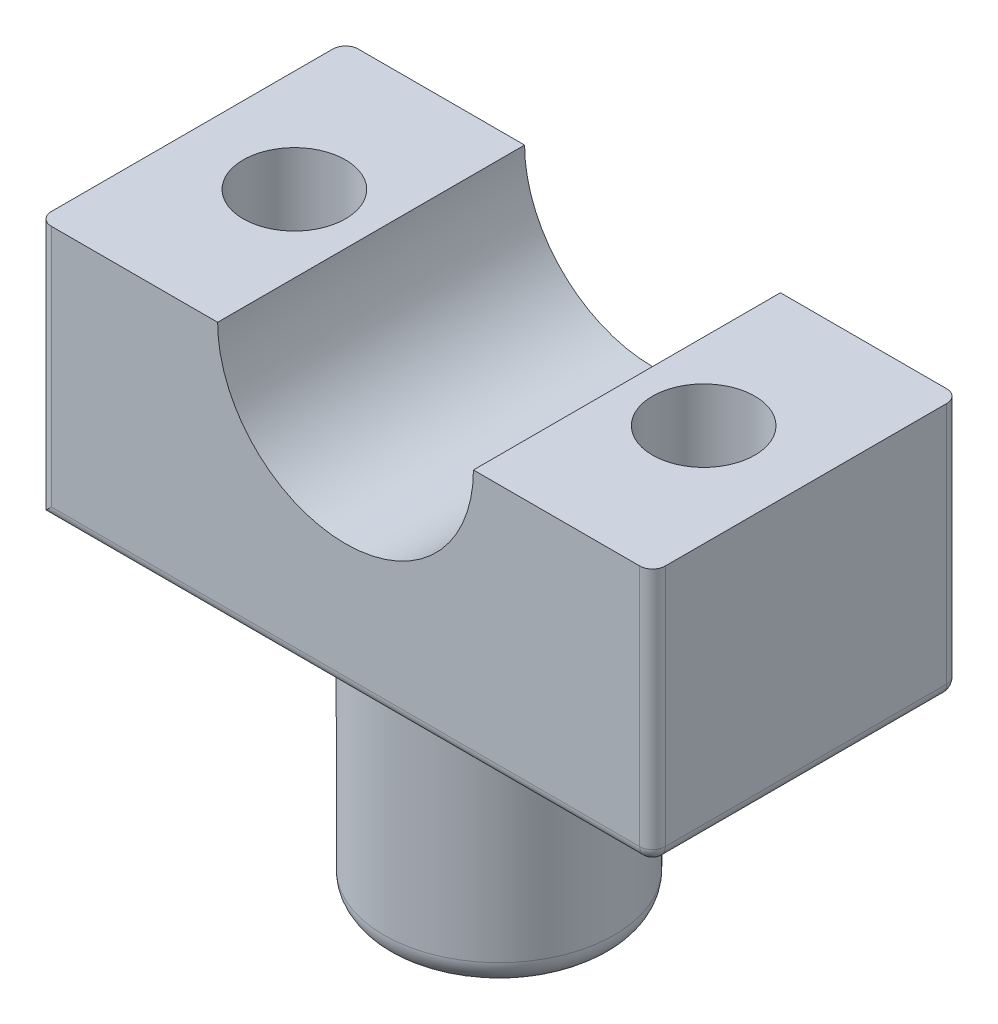
ISO-10303-21;
HEADER;
FILE_DESCRIPTION(('STEP AP214'),'2;1');
FILE_NAME('part.step','',(''),(''),'','','');
FILE_SCHEMA(('AUTOMOTIVE_DESIGN { 1 0 10303 214 1 1 1 1 }'));
ENDSEC;
DATA;
#1=APPLICATION_CONTEXT('core data for automotive mechanical design processes');
#2=APPLICATION_PROTOCOL_DEFINITION('international standard','automotive_design',2000,#1);
#3=PRODUCT_CONTEXT('',#1,'mechanical');
#4=PRODUCT('Part','Part','',(#3));
#5=PRODUCT_RELATED_PRODUCT_CATEGORY('part','',(#4));
#6=PRODUCT_DEFINITION_FORMATION('','',#4);
#7=PRODUCT_DEFINITION_CONTEXT('part definition',#1,'design');
#8=PRODUCT_DEFINITION('design','',#6,#7);
#9=PRODUCT_DEFINITION_SHAPE('','',#8);
#10=(LENGTH_UNIT() NAMED_UNIT(*) SI_UNIT(.MILLI.,.METRE.));
#11=(NAMED_UNIT(*) PLANE_ANGLE_UNIT() SI_UNIT($,.RADIAN.));
#12=(NAMED_UNIT(*) SI_UNIT($,.STERADIAN.) SOLID_ANGLE_UNIT());
#13=UNCERTAINTY_MEASURE_WITH_UNIT(LENGTH_MEASURE(1.E-05),#10,'distance_accuracy_value','');
#14=(GEOMETRIC_REPRESENTATION_CONTEXT(3) GLOBAL_UNCERTAINTY_ASSIGNED_CONTEXT((#13)) GLOBAL_UNIT_ASSIGNED_CONTEXT((#10,
#11,#12)) REPRESENTATION_CONTEXT('',''));
#15=CARTESIAN_POINT('',(0.,0.,0.));
#16=DIRECTION('',(0.,0.,1.));
#17=DIRECTION('',(1.,0.,0.));
#18=AXIS2_PLACEMENT_3D('',#15,#16,#17);
#19=CARTESIAN_POINT('',(0.,0.,12.));
#20=DIRECTION('',(0.,1.,0.));
#21=DIRECTION('',(0.,0.,1.));
#22=AXIS2_PLACEMENT_3D('',#19,#20,#21);
#23=PLANE('',#22);
#24=CARTESIAN_POINT('',(4.,0.,6.));
#25=DIRECTION('',(0.,1.,0.));
#26=DIRECTION('',(0.,0.,1.));
#27=AXIS2_PLACEMENT_3D('',#24,#25,#26);
#28=CIRCLE('',#27,2.);
#29=CARTESIAN_POINT('',(4.,0.,8.));
#30=VERTEX_POINT('',#29);
#31=EDGE_CURVE('E161',#30,#30,#28,.T.);
#32=ORIENTED_EDGE('',*,*,#31,.T.);
#33=EDGE_LOOP('',(#32));
#34=FACE_BOUND('',#33,.T.);
#35=DIRECTION('',(0.,0.,-1.));
#36=VECTOR('',#35,1.);
#37=CARTESIAN_POINT('',(0.,0.,12.));
#38=LINE('',#37,#36);
#39=CARTESIAN_POINT('',(0.,0.,11.5));
#40=VERTEX_POINT('',#39);
#41=CARTESIAN_POINT('',(0.,0.,0.5));
#42=VERTEX_POINT('',#41);
#43=EDGE_CURVE('E169',#40,#42,#38,.T.);
#44=ORIENTED_EDGE('',*,*,#43,.T.);
#45=DIRECTION('',(1.,0.,0.));
#46=VECTOR('',#45,1.);
#47=CARTESIAN_POINT('',(0.,0.,0.5));
#48=LINE('',#47,#46);
#49=CARTESIAN_POINT('',(12.,0.,0.5));
#50=VERTEX_POINT('',#49);
#51=EDGE_CURVE('E193',#42,#50,#48,.T.);
#52=ORIENTED_EDGE('',*,*,#51,.T.);
#53=CARTESIAN_POINT('',(12.,0.,6.));
#54=DIRECTION('',(0.,1.,0.));
#55=DIRECTION('',(0.,0.,1.));
#56=AXIS2_PLACEMENT_3D('',#53,#54,#55);
#57=CIRCLE('',#56,5.5);
#58=CARTESIAN_POINT('',(12.,0.,11.5));
#59=VERTEX_POINT('',#58);
#60=EDGE_CURVE('E181',#50,#59,#57,.T.);
#61=ORIENTED_EDGE('',*,*,#60,.T.);
#62=DIRECTION('',(1.,0.,0.));
#63=VECTOR('',#62,1.);
#64=CARTESIAN_POINT('',(0.,0.,11.5));
#65=LINE('',#64,#63);
#66=EDGE_CURVE('E185',#59,#40,#65,.F.);
#67=ORIENTED_EDGE('',*,*,#66,.T.);
#68=EDGE_LOOP('',(#44,#52,#61,#67));
#69=FACE_BOUND('',#68,.T.);
#70=ADVANCED_FACE('F37',(#34,#69),#23,.F.);
#71=CARTESIAN_POINT('',(0.,0.,12.));
#72=DIRECTION('',(1.,0.,0.));
#73=DIRECTION('',(0.,0.,-1.));
#74=AXIS2_PLACEMENT_3D('',#71,#72,#73);
#75=PLANE('',#74);
#76=DIRECTION('',(0.,0.,-1.));
#77=VECTOR('',#76,1.);
#78=CARTESIAN_POINT('',(0.,10.,12.));
#79=LINE('',#78,#77);
#80=CARTESIAN_POINT('',(0.,10.,11.5));
#81=VERTEX_POINT('',#80);
#82=CARTESIAN_POINT('',(0.,10.,0.5));
#83=VERTEX_POINT('',#82);
#84=EDGE_CURVE('E155',#81,#83,#79,.T.);
#85=ORIENTED_EDGE('',*,*,#84,.T.);
#86=DIRECTION('',(0.,-1.,0.));
#87=VECTOR('',#86,1.);
#88=CARTESIAN_POINT('',(0.,0.,0.5));
#89=LINE('',#88,#87);
#90=EDGE_CURVE('E204',#83,#42,#89,.T.);
#91=ORIENTED_EDGE('',*,*,#90,.T.);
#92=ORIENTED_EDGE('',*,*,#43,.F.);
#93=DIRECTION('',(0.,-1.,0.));
#94=VECTOR('',#93,1.);
#95=CARTESIAN_POINT('',(0.,10.,11.5));
#96=LINE('',#95,#94);
#97=EDGE_CURVE('E202',#40,#81,#96,.F.);
#98=ORIENTED_EDGE('',*,*,#97,.T.);
#99=EDGE_LOOP('',(#85,#91,#92,#98));
#100=FACE_BOUND('',#99,.T.);
#101=ADVANCED_FACE('F281',(#100),#75,.F.);
#102=EDGE_CURVE('E182',#59,#50,#57,.T.);
#103=ORIENTED_EDGE('',*,*,#102,.T.);
#104=DIRECTION('',(1.,0.,0.));
#105=VECTOR('',#104,1.);
#106=CARTESIAN_POINT('',(0.,0.,0.5));
#107=LINE('',#106,#105);
#108=CARTESIAN_POINT('',(23.5,0.,0.5));
#109=VERTEX_POINT('',#108);
#110=EDGE_CURVE('E191',#50,#109,#107,.T.);
#111=ORIENTED_EDGE('',*,*,#110,.T.);
#112=DIRECTION('',(0.,0.,-1.));
#113=VECTOR('',#112,1.);
#114=CARTESIAN_POINT('',(23.5,0.,12.));
#115=LINE('',#114,#113);
#116=CARTESIAN_POINT('',(23.5,0.,11.5));
#117=VERTEX_POINT('',#116);
#118=EDGE_CURVE('E189',#109,#117,#115,.F.);
#119=ORIENTED_EDGE('',*,*,#118,.T.);
#120=DIRECTION('',(1.,0.,0.));
#121=VECTOR('',#120,1.);
#122=CARTESIAN_POINT('',(0.,0.,11.5));
#123=LINE('',#122,#121);
#124=EDGE_CURVE('E187',#117,#59,#123,.F.);
#125=ORIENTED_EDGE('',*,*,#124,.T.);
#126=EDGE_LOOP('',(#103,#111,#119,#125));
#127=FACE_BOUND('',#126,.T.);
#128=CARTESIAN_POINT('',(20.,0.,6.));
#129=DIRECTION('',(0.,1.,0.));
#130=DIRECTION('',(0.,0.,1.));
#131=AXIS2_PLACEMENT_3D('',#128,#129,#130);
#132=CIRCLE('',#131,2.);
#133=CARTESIAN_POINT('',(20.,0.,8.));
#134=VERTEX_POINT('',#133);
#135=EDGE_CURVE('E262',#134,#134,#132,.T.);
#136=ORIENTED_EDGE('',*,*,#135,.T.);
#137=EDGE_LOOP('',(#136));
#138=FACE_BOUND('',#137,.T.);
#139=ADVANCED_FACE('F278',(#127,#138),#23,.F.);
#140=CARTESIAN_POINT('',(24.,0.,12.));
#141=DIRECTION('',(-1.,0.,0.));
#142=DIRECTION('',(0.,0.,1.));
#143=AXIS2_PLACEMENT_3D('',#140,#141,#142);
#144=PLANE('',#143);
#145=DIRECTION('',(0.,0.,-1.));
#146=VECTOR('',#145,1.);
#147=CARTESIAN_POINT('',(24.,0.5,12.));
#148=LINE('',#147,#146);
#149=CARTESIAN_POINT('',(24.,0.5,11.5));
#150=VERTEX_POINT('',#149);
#151=CARTESIAN_POINT('',(24.,0.5,0.5));
#152=VERTEX_POINT('',#151);
#153=EDGE_CURVE('E54',#150,#152,#148,.T.);
#154=ORIENTED_EDGE('',*,*,#153,.T.);
#155=DIRECTION('',(0.,1.,0.));
#156=VECTOR('',#155,1.);
#157=CARTESIAN_POINT('',(24.,0.,0.5));
#158=LINE('',#157,#156);
#159=CARTESIAN_POINT('',(24.,10.,0.5));
#160=VERTEX_POINT('',#159);
#161=EDGE_CURVE('E217',#152,#160,#158,.T.);
#162=ORIENTED_EDGE('',*,*,#161,.T.);
#163=DIRECTION('',(0.,0.,-1.));
#164=VECTOR('',#163,1.);
#165=CARTESIAN_POINT('',(24.,10.,12.));
#166=LINE('',#165,#164);
#167=CARTESIAN_POINT('',(24.,10.,11.5));
#168=VERTEX_POINT('',#167);
#169=EDGE_CURVE('E147',#168,#160,#166,.T.);
#170=ORIENTED_EDGE('',*,*,#169,.F.);
#171=DIRECTION('',(0.,1.,0.));
#172=VECTOR('',#171,1.);
#173=CARTESIAN_POINT('',(24.,0.,11.5));
#174=LINE('',#173,#172);
#175=EDGE_CURVE('E59',#168,#150,#174,.F.);
#176=ORIENTED_EDGE('',*,*,#175,.T.);
#177=EDGE_LOOP('',(#154,#162,#170,#176));
#178=FACE_BOUND('',#177,.T.);
#179=ADVANCED_FACE('F270',(#178),#144,.F.);
#180=CARTESIAN_POINT('',(17.,10.,12.));
#181=DIRECTION('',(0.,-1.,0.));
#182=DIRECTION('',(0.,0.,-1.));
#183=AXIS2_PLACEMENT_3D('',#180,#181,#182);
#184=PLANE('',#183);
#185=CARTESIAN_POINT('',(20.,10.,6.));
#186=DIRECTION('',(0.,1.,0.));
#187=DIRECTION('',(0.,0.,1.));
#188=AXIS2_PLACEMENT_3D('',#185,#186,#187);
#189=CIRCLE('',#188,2.);
#190=CARTESIAN_POINT('',(20.,10.,8.));
#191=VERTEX_POINT('',#190);
#192=EDGE_CURVE('E254',#191,#191,#189,.T.);
#193=ORIENTED_EDGE('',*,*,#192,.F.);
#194=EDGE_LOOP('',(#193));
#195=FACE_BOUND('',#194,.T.);
#196=ORIENTED_EDGE('',*,*,#169,.T.);
#197=CARTESIAN_POINT('',(23.5,10.,0.5));
#198=DIRECTION('',(0.,-1.,0.));
#199=DIRECTION('',(0.,0.,-1.));
#200=AXIS2_PLACEMENT_3D('',#197,#198,#199);
#201=CIRCLE('',#200,0.5);
#202=CARTESIAN_POINT('',(23.5,10.,0.));
#203=VERTEX_POINT('',#202);
#204=EDGE_CURVE('E11',#160,#203,#201,.F.);
#205=ORIENTED_EDGE('',*,*,#204,.T.);
#206=DIRECTION('',(-1.,0.,0.));
#207=VECTOR('',#206,1.);
#208=CARTESIAN_POINT('',(17.,10.,0.));
#209=LINE('',#208,#207);
#210=CARTESIAN_POINT('',(17.,10.,0.));
#211=VERTEX_POINT('',#210);
#212=EDGE_CURVE('E144',#203,#211,#209,.T.);
#213=ORIENTED_EDGE('',*,*,#212,.T.);
#214=DIRECTION('',(0.,0.,-1.));
#215=VECTOR('',#214,1.);
#216=CARTESIAN_POINT('',(17.,10.,12.));
#217=LINE('',#216,#215);
#218=CARTESIAN_POINT('',(17.,10.,12.));
#219=VERTEX_POINT('',#218);
#220=EDGE_CURVE('E140',#219,#211,#217,.T.);
#221=ORIENTED_EDGE('',*,*,#220,.F.);
#222=DIRECTION('',(-1.,0.,0.));
#223=VECTOR('',#222,1.);
#224=CARTESIAN_POINT('',(17.,10.,12.));
#225=LINE('',#224,#223);
#226=CARTESIAN_POINT('',(23.5,10.,12.));
#227=VERTEX_POINT('',#226);
#228=EDGE_CURVE('E126',#227,#219,#225,.T.);
#229=ORIENTED_EDGE('',*,*,#228,.F.);
#230=CARTESIAN_POINT('',(23.5,10.,11.5));
#231=DIRECTION('',(0.,-1.,0.));
#232=DIRECTION('',(0.,0.,-1.));
#233=AXIS2_PLACEMENT_3D('',#230,#231,#232);
#234=CIRCLE('',#233,0.5);
#235=EDGE_CURVE('E46',#227,#168,#234,.F.);
#236=ORIENTED_EDGE('',*,*,#235,.T.);
#237=EDGE_LOOP('',(#196,#205,#213,#221,#229,#236));
#238=FACE_BOUND('',#237,.T.);
#239=ADVANCED_FACE('F142',(#195,#238),#184,.F.);
#240=CARTESIAN_POINT('',(12.,10.,12.));
#241=DIRECTION('',(0.,0.,-1.));
#242=DIRECTION('',(-1.,0.,0.));
#243=AXIS2_PLACEMENT_3D('',#240,#241,#242);
#244=CYLINDRICAL_SURFACE('',#243,5.);
#245=CARTESIAN_POINT('',(12.,10.,0.));
#246=DIRECTION('',(0.,0.,-1.));
#247=DIRECTION('',(1.,0.,0.));
#248=AXIS2_PLACEMENT_3D('',#245,#246,#247);
#249=CIRCLE('',#248,5.);
#250=CARTESIAN_POINT('',(7.,10.,0.));
#251=VERTEX_POINT('',#250);
#252=EDGE_CURVE('E160',#211,#251,#249,.T.);
#253=ORIENTED_EDGE('',*,*,#252,.T.);
#254=DIRECTION('',(0.,0.,-1.));
#255=VECTOR('',#254,1.);
#256=CARTESIAN_POINT('',(7.,10.,12.));
#257=LINE('',#256,#255);
#258=CARTESIAN_POINT('',(7.,10.,12.));
#259=VERTEX_POINT('',#258);
#260=EDGE_CURVE('E148',#259,#251,#257,.T.);
#261=ORIENTED_EDGE('',*,*,#260,.F.);
#262=CARTESIAN_POINT('',(12.,10.,12.));
#263=DIRECTION('',(0.,0.,-1.));
#264=DIRECTION('',(1.,0.,0.));
#265=AXIS2_PLACEMENT_3D('',#262,#263,#264);
#266=CIRCLE('',#265,5.);
#267=EDGE_CURVE('E131',#219,#259,#266,.T.);
#268=ORIENTED_EDGE('',*,*,#267,.F.);
#269=ORIENTED_EDGE('',*,*,#220,.T.);
#270=EDGE_LOOP('',(#253,#261,#268,#269));
#271=FACE_BOUND('',#270,.T.);
#272=ADVANCED_FACE('F150',(#271),#244,.F.);
#273=CARTESIAN_POINT('',(0.,10.,12.));
#274=DIRECTION('',(0.,-1.,0.));
#275=DIRECTION('',(0.,0.,-1.));
#276=AXIS2_PLACEMENT_3D('',#273,#274,#275);
#277=PLANE('',#276);
#278=CARTESIAN_POINT('',(4.,10.,6.));
#279=DIRECTION('',(0.,1.,0.));
#280=DIRECTION('',(0.,0.,1.));
#281=AXIS2_PLACEMENT_3D('',#278,#279,#280);
#282=CIRCLE('',#281,2.);
#283=CARTESIAN_POINT('',(4.,10.,8.));
#284=VERTEX_POINT('',#283);
#285=EDGE_CURVE('E259',#284,#284,#282,.T.);
#286=ORIENTED_EDGE('',*,*,#285,.F.);
#287=EDGE_LOOP('',(#286));
#288=FACE_BOUND('',#287,.T.);
#289=DIRECTION('',(-1.,0.,0.));
#290=VECTOR('',#289,1.);
#291=CARTESIAN_POINT('',(0.,10.,0.));
#292=LINE('',#291,#290);
#293=CARTESIAN_POINT('',(0.5,10.,0.));
#294=VERTEX_POINT('',#293);
#295=EDGE_CURVE('E137',#251,#294,#292,.T.);
#296=ORIENTED_EDGE('',*,*,#295,.T.);
#297=CARTESIAN_POINT('',(0.5,10.,0.5));
#298=DIRECTION('',(0.,-1.,0.));
#299=DIRECTION('',(0.,0.,-1.));
#300=AXIS2_PLACEMENT_3D('',#297,#298,#299);
#301=CIRCLE('',#300,0.5);
#302=EDGE_CURVE('E208',#294,#83,#301,.F.);
#303=ORIENTED_EDGE('',*,*,#302,.T.);
#304=ORIENTED_EDGE('',*,*,#84,.F.);
#305=CARTESIAN_POINT('',(0.5,10.,11.5));
#306=DIRECTION('',(0.,-1.,0.));
#307=DIRECTION('',(0.,0.,-1.));
#308=AXIS2_PLACEMENT_3D('',#305,#306,#307);
#309=CIRCLE('',#308,0.5);
#310=CARTESIAN_POINT('',(0.5,10.,12.));
#311=VERTEX_POINT('',#310);
#312=EDGE_CURVE('E206',#81,#311,#309,.F.);
#313=ORIENTED_EDGE('',*,*,#312,.T.);
#314=DIRECTION('',(-1.,0.,0.));
#315=VECTOR('',#314,1.);
#316=CARTESIAN_POINT('',(0.,10.,12.));
#317=LINE('',#316,#315);
#318=EDGE_CURVE('E153',#259,#311,#317,.T.);
#319=ORIENTED_EDGE('',*,*,#318,.F.);
#320=ORIENTED_EDGE('',*,*,#260,.T.);
#321=EDGE_LOOP('',(#296,#303,#304,#313,#319,#320));
#322=FACE_BOUND('',#321,.T.);
#323=ADVANCED_FACE('F276',(#288,#322),#277,.F.);
#324=CARTESIAN_POINT('',(12.,10.,12.));
#325=DIRECTION('',(0.,0.,1.));
#326=DIRECTION('',(1.,0.,0.));
#327=AXIS2_PLACEMENT_3D('',#324,#325,#326);
#328=PLANE('',#327);
#329=ORIENTED_EDGE('',*,*,#318,.T.);
#330=DIRECTION('',(0.,-1.,0.));
#331=VECTOR('',#330,1.);
#332=CARTESIAN_POINT('',(0.5,0.,12.));
#333=LINE('',#332,#331);
#334=CARTESIAN_POINT('',(0.5,0.5,12.));
#335=VERTEX_POINT('',#334);
#336=EDGE_CURVE('E213',#311,#335,#333,.T.);
#337=ORIENTED_EDGE('',*,*,#336,.T.);
#338=DIRECTION('',(1.,0.,0.));
#339=VECTOR('',#338,1.);
#340=CARTESIAN_POINT('',(24.,0.5,12.));
#341=LINE('',#340,#339);
#342=CARTESIAN_POINT('',(23.5,0.5,12.));
#343=VERTEX_POINT('',#342);
#344=EDGE_CURVE('E210',#335,#343,#341,.T.);
#345=ORIENTED_EDGE('',*,*,#344,.T.);
#346=DIRECTION('',(0.,1.,0.));
#347=VECTOR('',#346,1.);
#348=CARTESIAN_POINT('',(23.5,10.,12.));
#349=LINE('',#348,#347);
#350=EDGE_CURVE('E134',#343,#227,#349,.T.);
#351=ORIENTED_EDGE('',*,*,#350,.T.);
#352=ORIENTED_EDGE('',*,*,#228,.T.);
#353=ORIENTED_EDGE('',*,*,#267,.T.);
#354=EDGE_LOOP('',(#329,#337,#345,#351,#352,#353));
#355=FACE_BOUND('',#354,.T.);
#356=ADVANCED_FACE('F129',(#355),#328,.T.);
#357=CARTESIAN_POINT('',(12.,10.,0.));
#358=DIRECTION('',(0.,0.,1.));
#359=DIRECTION('',(1.,0.,0.));
#360=AXIS2_PLACEMENT_3D('',#357,#358,#359);
#361=PLANE('',#360);
#362=DIRECTION('',(1.,0.,0.));
#363=VECTOR('',#362,1.);
#364=CARTESIAN_POINT('',(12.,0.5,0.));
#365=LINE('',#364,#363);
#366=CARTESIAN_POINT('',(23.5,0.5,0.));
#367=VERTEX_POINT('',#366);
#368=CARTESIAN_POINT('',(0.5,0.5,0.));
#369=VERTEX_POINT('',#368);
#370=EDGE_CURVE('E198',#367,#369,#365,.F.);
#371=ORIENTED_EDGE('',*,*,#370,.T.);
#372=DIRECTION('',(0.,-1.,0.));
#373=VECTOR('',#372,1.);
#374=CARTESIAN_POINT('',(0.5,10.,0.));
#375=LINE('',#374,#373);
#376=EDGE_CURVE('E200',#369,#294,#375,.F.);
#377=ORIENTED_EDGE('',*,*,#376,.T.);
#378=ORIENTED_EDGE('',*,*,#295,.F.);
#379=ORIENTED_EDGE('',*,*,#252,.F.);
#380=ORIENTED_EDGE('',*,*,#212,.F.);
#381=DIRECTION('',(0.,1.,0.));
#382=VECTOR('',#381,1.);
#383=CARTESIAN_POINT('',(23.5,10.,0.));
#384=LINE('',#383,#382);
#385=EDGE_CURVE('E196',#203,#367,#384,.F.);
#386=ORIENTED_EDGE('',*,*,#385,.T.);
#387=EDGE_LOOP('',(#371,#377,#378,#379,#380,#386));
#388=FACE_BOUND('',#387,.T.);
#389=ADVANCED_FACE('F313',(#388),#361,.F.);
#390=CARTESIAN_POINT('',(4.,0.,6.));
#391=DIRECTION('',(0.,1.,0.));
#392=DIRECTION('',(0.,0.,1.));
#393=AXIS2_PLACEMENT_3D('',#390,#391,#392);
#394=CYLINDRICAL_SURFACE('',#393,2.);
#395=ORIENTED_EDGE('',*,*,#31,.F.);
#396=EDGE_LOOP('',(#395));
#397=FACE_BOUND('',#396,.T.);
#398=ORIENTED_EDGE('',*,*,#285,.T.);
#399=EDGE_LOOP('',(#398));
#400=FACE_BOUND('',#399,.T.);
#401=ADVANCED_FACE('F304',(#397,#400),#394,.F.);
#402=CARTESIAN_POINT('',(20.,0.,6.));
#403=DIRECTION('',(0.,1.,0.));
#404=DIRECTION('',(0.,0.,1.));
#405=AXIS2_PLACEMENT_3D('',#402,#403,#404);
#406=CYLINDRICAL_SURFACE('',#405,2.);
#407=ORIENTED_EDGE('',*,*,#135,.F.);
#408=EDGE_LOOP('',(#407));
#409=FACE_BOUND('',#408,.T.);
#410=ORIENTED_EDGE('',*,*,#192,.T.);
#411=EDGE_LOOP('',(#410));
#412=FACE_BOUND('',#411,.T.);
#413=ADVANCED_FACE('F267',(#409,#412),#406,.F.);
#414=CARTESIAN_POINT('',(12.,-10.,6.));
#415=DIRECTION('',(0.,-1.,0.));
#416=DIRECTION('',(0.,0.,-1.));
#417=AXIS2_PLACEMENT_3D('',#414,#415,#416);
#418=PLANE('',#417);
#419=CARTESIAN_POINT('',(12.,-10.,6.));
#420=DIRECTION('',(0.,-1.,0.));
#421=DIRECTION('',(0.,0.,-1.));
#422=AXIS2_PLACEMENT_3D('',#419,#420,#421);
#423=CIRCLE('',#422,3.5);
#424=CARTESIAN_POINT('',(12.,-10.,2.5));
#425=VERTEX_POINT('',#424);
#426=EDGE_CURVE('E172',#425,#425,#423,.T.);
#427=ORIENTED_EDGE('',*,*,#426,.T.);
#428=EDGE_LOOP('',(#427));
#429=FACE_BOUND('',#428,.T.);
#430=CARTESIAN_POINT('',(12.,-10.,6.));
#431=DIRECTION('',(0.,-1.,0.));
#432=DIRECTION('',(0.,0.,-1.));
#433=AXIS2_PLACEMENT_3D('',#430,#431,#432);
#434=CIRCLE('',#433,2.5);
#435=CARTESIAN_POINT('',(12.,-10.,3.5));
#436=VERTEX_POINT('',#435);
#437=EDGE_CURVE('E249',#436,#436,#434,.T.);
#438=ORIENTED_EDGE('',*,*,#437,.F.);
#439=EDGE_LOOP('',(#438));
#440=FACE_BOUND('',#439,.T.);
#441=ADVANCED_FACE('F303',(#429,#440),#418,.T.);
#442=CARTESIAN_POINT('',(12.,-10.,6.));
#443=DIRECTION('',(0.,1.,0.));
#444=DIRECTION('',(0.,0.,1.));
#445=AXIS2_PLACEMENT_3D('',#442,#443,#444);
#446=CYLINDRICAL_SURFACE('',#445,4.5);
#447=CARTESIAN_POINT('',(12.,-9.,6.));
#448=DIRECTION('',(0.,-1.,0.));
#449=DIRECTION('',(0.,0.,-1.));
#450=AXIS2_PLACEMENT_3D('',#447,#448,#449);
#451=CIRCLE('',#450,4.5);
#452=CARTESIAN_POINT('',(12.,-9.,1.5));
#453=VERTEX_POINT('',#452);
#454=EDGE_CURVE('E178',#453,#453,#451,.F.);
#455=ORIENTED_EDGE('',*,*,#454,.T.);
#456=EDGE_LOOP('',(#455));
#457=FACE_BOUND('',#456,.T.);
#458=CARTESIAN_POINT('',(12.,-0.999999999999999,6.));
#459=DIRECTION('',(0.,1.,0.));
#460=DIRECTION('',(0.,0.,1.));
#461=AXIS2_PLACEMENT_3D('',#458,#459,#460);
#462=CIRCLE('',#461,4.5);
#463=CARTESIAN_POINT('',(12.,-0.999999999999999,10.5));
#464=VERTEX_POINT('',#463);
#465=EDGE_CURVE('E175',#464,#464,#462,.F.);
#466=ORIENTED_EDGE('',*,*,#465,.T.);
#467=EDGE_LOOP('',(#466));
#468=FACE_BOUND('',#467,.T.);
#469=ADVANCED_FACE('F310',(#457,#468),#446,.T.);
#470=CARTESIAN_POINT('',(12.,-10.,6.));
#471=DIRECTION('',(0.,1.,0.));
#472=DIRECTION('',(0.,0.,1.));
#473=AXIS2_PLACEMENT_3D('',#470,#471,#472);
#474=CYLINDRICAL_SURFACE('',#473,2.5);
#475=ORIENTED_EDGE('',*,*,#437,.T.);
#476=EDGE_LOOP('',(#475));
#477=FACE_BOUND('',#476,.T.);
#478=CARTESIAN_POINT('',(12.,0.,6.));
#479=DIRECTION('',(0.,-1.,0.));
#480=DIRECTION('',(0.,0.,-1.));
#481=AXIS2_PLACEMENT_3D('',#478,#479,#480);
#482=CIRCLE('',#481,2.5);
#483=CARTESIAN_POINT('',(12.,0.,3.5));
#484=VERTEX_POINT('',#483);
#485=EDGE_CURVE('E243',#484,#484,#482,.T.);
#486=ORIENTED_EDGE('',*,*,#485,.F.);
#487=EDGE_LOOP('',(#486));
#488=FACE_BOUND('',#487,.T.);
#489=ADVANCED_FACE('F293',(#477,#488),#474,.F.);
#490=ORIENTED_EDGE('',*,*,#485,.T.);
#491=EDGE_LOOP('',(#490));
#492=FACE_BOUND('',#491,.T.);
#493=ADVANCED_FACE('F284',(#492),#23,.F.);
#494=CARTESIAN_POINT('',(12.,-9.,6.));
#495=DIRECTION('',(0.,-1.,0.));
#496=DIRECTION('',(0.,0.,-1.));
#497=AXIS2_PLACEMENT_3D('',#494,#495,#496);
#498=TOROIDAL_SURFACE('',#497,3.5,1.);
#499=ORIENTED_EDGE('',*,*,#454,.F.);
#500=EDGE_LOOP('',(#499));
#501=FACE_BOUND('',#500,.T.);
#502=ORIENTED_EDGE('',*,*,#426,.F.);
#503=EDGE_LOOP('',(#502));
#504=FACE_BOUND('',#503,.T.);
#505=ADVANCED_FACE('F292',(#501,#504),#498,.T.);
#506=CARTESIAN_POINT('',(12.,-0.999999999999999,6.));
#507=DIRECTION('',(0.,1.,0.));
#508=DIRECTION('',(0.,0.,1.));
#509=AXIS2_PLACEMENT_3D('',#506,#507,#508);
#510=TOROIDAL_SURFACE('',#509,5.5,1.);
#511=ORIENTED_EDGE('',*,*,#102,.F.);
#512=ORIENTED_EDGE('',*,*,#60,.F.);
#513=EDGE_LOOP('',(#511,#512));
#514=FACE_BOUND('',#513,.T.);
#515=ORIENTED_EDGE('',*,*,#465,.F.);
#516=EDGE_LOOP('',(#515));
#517=FACE_BOUND('',#516,.T.);
#518=ADVANCED_FACE('F375',(#514,#517),#510,.F.);
#519=CARTESIAN_POINT('',(0.5,10.,11.5));
#520=DIRECTION('',(0.,1.,0.));
#521=DIRECTION('',(0.,0.,1.));
#522=AXIS2_PLACEMENT_3D('',#519,#520,#521);
#523=CYLINDRICAL_SURFACE('',#522,0.5);
#524=ORIENTED_EDGE('',*,*,#312,.F.);
#525=ORIENTED_EDGE('',*,*,#97,.F.);
#526=CARTESIAN_POINT('',(0.5,0.5,11.5));
#527=DIRECTION('',(-0.707106781186547,0.707106781186547,0.));
#528=DIRECTION('',(-0.707106781186547,-0.707106781186547,0.));
#529=AXIS2_PLACEMENT_3D('',#526,#527,#528);
#530=ELLIPSE('',#529,0.707106781186547,0.5);
#531=EDGE_CURVE('E41',#335,#40,#530,.F.);
#532=ORIENTED_EDGE('',*,*,#531,.F.);
#533=ORIENTED_EDGE('',*,*,#336,.F.);
#534=EDGE_LOOP('',(#524,#525,#532,#533));
#535=FACE_BOUND('',#534,.T.);
#536=ADVANCED_FACE('F39',(#535),#523,.T.);
#537=CARTESIAN_POINT('',(12.,0.5,11.5));
#538=DIRECTION('',(-1.,0.,0.));
#539=DIRECTION('',(0.,0.,1.));
#540=AXIS2_PLACEMENT_3D('',#537,#538,#539);
#541=CYLINDRICAL_SURFACE('',#540,0.5);
#542=ORIENTED_EDGE('',*,*,#66,.F.);
#543=ORIENTED_EDGE('',*,*,#124,.F.);
#544=CARTESIAN_POINT('',(23.5,0.5,11.5));
#545=DIRECTION('',(1.,0.,0.));
#546=DIRECTION('',(0.,0.,-1.));
#547=AXIS2_PLACEMENT_3D('',#544,#545,#546);
#548=CIRCLE('',#547,0.5);
#549=EDGE_CURVE('E237',#343,#117,#548,.T.);
#550=ORIENTED_EDGE('',*,*,#549,.F.);
#551=ORIENTED_EDGE('',*,*,#344,.F.);
#552=ORIENTED_EDGE('',*,*,#531,.T.);
#553=EDGE_LOOP('',(#542,#543,#550,#551,#552));
#554=FACE_BOUND('',#553,.T.);
#555=ADVANCED_FACE('F343',(#554),#541,.T.);
#556=CARTESIAN_POINT('',(23.5,10.,11.5));
#557=DIRECTION('',(0.,-1.,0.));
#558=DIRECTION('',(0.,0.,-1.));
#559=AXIS2_PLACEMENT_3D('',#556,#557,#558);
#560=CYLINDRICAL_SURFACE('',#559,0.5);
#561=ORIENTED_EDGE('',*,*,#235,.F.);
#562=ORIENTED_EDGE('',*,*,#350,.F.);
#563=CARTESIAN_POINT('',(23.5,0.5,11.5));
#564=DIRECTION('',(0.,-1.,0.));
#565=DIRECTION('',(0.,0.,-1.));
#566=AXIS2_PLACEMENT_3D('',#563,#564,#565);
#567=CIRCLE('',#566,0.5);
#568=EDGE_CURVE('E235',#150,#343,#567,.T.);
#569=ORIENTED_EDGE('',*,*,#568,.F.);
#570=ORIENTED_EDGE('',*,*,#175,.F.);
#571=EDGE_LOOP('',(#561,#562,#569,#570));
#572=FACE_BOUND('',#571,.T.);
#573=ADVANCED_FACE('F360',(#572),#560,.T.);
#574=CARTESIAN_POINT('',(23.5,0.5,11.5));
#575=DIRECTION('',(0.,0.,1.));
#576=DIRECTION('',(0.,-1.,0.));
#577=AXIS2_PLACEMENT_3D('',#574,#575,#576);
#578=SPHERICAL_SURFACE('',#577,0.5);
#579=ORIENTED_EDGE('',*,*,#568,.T.);
#580=ORIENTED_EDGE('',*,*,#549,.T.);
#581=CARTESIAN_POINT('',(23.5,0.5,11.5));
#582=DIRECTION('',(0.,0.,1.));
#583=DIRECTION('',(1.,0.,0.));
#584=AXIS2_PLACEMENT_3D('',#581,#582,#583);
#585=CIRCLE('',#584,0.5);
#586=EDGE_CURVE('E232',#150,#117,#585,.F.);
#587=ORIENTED_EDGE('',*,*,#586,.F.);
#588=EDGE_LOOP('',(#579,#580,#587));
#589=FACE_BOUND('',#588,.T.);
#590=ADVANCED_FACE('F361',(#589),#578,.T.);
#591=CARTESIAN_POINT('',(23.5,0.5,12.));
#592=DIRECTION('',(0.,0.,-1.));
#593=DIRECTION('',(-1.,0.,0.));
#594=AXIS2_PLACEMENT_3D('',#591,#592,#593);
#595=CYLINDRICAL_SURFACE('',#594,0.5);
#596=ORIENTED_EDGE('',*,*,#586,.T.);
#597=ORIENTED_EDGE('',*,*,#118,.F.);
#598=CARTESIAN_POINT('',(23.5,0.5,0.5));
#599=DIRECTION('',(0.,0.,-1.));
#600=DIRECTION('',(-1.,0.,0.));
#601=AXIS2_PLACEMENT_3D('',#598,#599,#600);
#602=CIRCLE('',#601,0.5);
#603=EDGE_CURVE('E229',#152,#109,#602,.T.);
#604=ORIENTED_EDGE('',*,*,#603,.F.);
#605=ORIENTED_EDGE('',*,*,#153,.F.);
#606=EDGE_LOOP('',(#596,#597,#604,#605));
#607=FACE_BOUND('',#606,.T.);
#608=ADVANCED_FACE('F347',(#607),#595,.T.);
#609=CARTESIAN_POINT('',(23.5,0.,0.5));
#610=DIRECTION('',(0.,1.,0.));
#611=DIRECTION('',(0.,0.,1.));
#612=AXIS2_PLACEMENT_3D('',#609,#610,#611);
#613=CYLINDRICAL_SURFACE('',#612,0.5);
#614=ORIENTED_EDGE('',*,*,#204,.F.);
#615=ORIENTED_EDGE('',*,*,#161,.F.);
#616=CARTESIAN_POINT('',(23.5,0.5,0.5));
#617=DIRECTION('',(0.,-1.,0.));
#618=DIRECTION('',(0.,0.,-1.));
#619=AXIS2_PLACEMENT_3D('',#616,#617,#618);
#620=CIRCLE('',#619,0.5);
#621=EDGE_CURVE('E226',#367,#152,#620,.T.);
#622=ORIENTED_EDGE('',*,*,#621,.F.);
#623=ORIENTED_EDGE('',*,*,#385,.F.);
#624=EDGE_LOOP('',(#614,#615,#622,#623));
#625=FACE_BOUND('',#624,.T.);
#626=ADVANCED_FACE('F358',(#625),#613,.T.);
#627=CARTESIAN_POINT('',(0.5,0.,0.5));
#628=DIRECTION('',(0.,-1.,0.));
#629=DIRECTION('',(0.,0.,-1.));
#630=AXIS2_PLACEMENT_3D('',#627,#628,#629);
#631=CYLINDRICAL_SURFACE('',#630,0.5);
#632=ORIENTED_EDGE('',*,*,#302,.F.);
#633=ORIENTED_EDGE('',*,*,#376,.F.);
#634=CARTESIAN_POINT('',(0.5,0.5,0.5));
#635=DIRECTION('',(0.707106781186547,-0.707106781186547,0.));
#636=DIRECTION('',(-0.707106781186547,-0.707106781186547,0.));
#637=AXIS2_PLACEMENT_3D('',#634,#635,#636);
#638=ELLIPSE('',#637,0.707106781186547,0.5);
#639=EDGE_CURVE('E223',#42,#369,#638,.T.);
#640=ORIENTED_EDGE('',*,*,#639,.F.);
#641=ORIENTED_EDGE('',*,*,#90,.F.);
#642=EDGE_LOOP('',(#632,#633,#640,#641));
#643=FACE_BOUND('',#642,.T.);
#644=ADVANCED_FACE('F335',(#643),#631,.T.);
#645=CARTESIAN_POINT('',(23.5,0.5,0.5));
#646=DIRECTION('',(1.,0.,0.));
#647=DIRECTION('',(0.,0.,-1.));
#648=AXIS2_PLACEMENT_3D('',#645,#646,#647);
#649=SPHERICAL_SURFACE('',#648,0.5);
#650=ORIENTED_EDGE('',*,*,#621,.T.);
#651=ORIENTED_EDGE('',*,*,#603,.T.);
#652=CARTESIAN_POINT('',(23.5,0.5,0.5));
#653=DIRECTION('',(1.,0.,0.));
#654=DIRECTION('',(0.,0.,-1.));
#655=AXIS2_PLACEMENT_3D('',#652,#653,#654);
#656=CIRCLE('',#655,0.5);
#657=EDGE_CURVE('E220',#367,#109,#656,.F.);
#658=ORIENTED_EDGE('',*,*,#657,.F.);
#659=EDGE_LOOP('',(#650,#651,#658));
#660=FACE_BOUND('',#659,.T.);
#661=ADVANCED_FACE('F350',(#660),#649,.T.);
#662=CARTESIAN_POINT('',(0.,0.5,0.5));
#663=DIRECTION('',(1.,0.,0.));
#664=DIRECTION('',(0.,0.,-1.));
#665=AXIS2_PLACEMENT_3D('',#662,#663,#664);
#666=CYLINDRICAL_SURFACE('',#665,0.5);
#667=ORIENTED_EDGE('',*,*,#639,.T.);
#668=ORIENTED_EDGE('',*,*,#370,.F.);
#669=ORIENTED_EDGE('',*,*,#657,.T.);
#670=ORIENTED_EDGE('',*,*,#110,.F.);
#671=ORIENTED_EDGE('',*,*,#51,.F.);
#672=EDGE_LOOP('',(#667,#668,#669,#670,#671));
#673=FACE_BOUND('',#672,.T.);
#674=ADVANCED_FACE('F354',(#673),#666,.T.);
#675=CLOSED_SHELL('',(#70,#101,#139,#179,#239,#272,#323,#356,#389,#401,#413,#441,#469,#489,#493,
#505,#518,#536,#555,#573,#590,#608,#626,#644,#661,#674));
#676=MANIFOLD_SOLID_BREP('B2',#675);
#677=ADVANCED_BREP_SHAPE_REPRESENTATION('',(#18,#676),#14);
#678=SHAPE_DEFINITION_REPRESENTATION(#9,#677);
ENDSEC;
END-ISO-10303-21;
